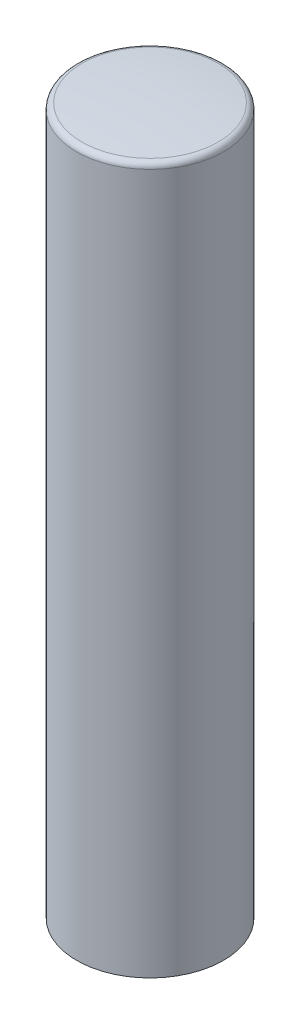
ISO-10303-21;
HEADER;
FILE_DESCRIPTION(('STEP AP214'),'2;1');
FILE_NAME('part.step','',(''),(''),'','','');
FILE_SCHEMA(('AUTOMOTIVE_DESIGN { 1 0 10303 214 1 1 1 1 }'));
ENDSEC;
DATA;
#1=APPLICATION_CONTEXT('core data for automotive mechanical design processes');
#2=APPLICATION_PROTOCOL_DEFINITION('international standard','automotive_design',2000,#1);
#3=PRODUCT_CONTEXT('',#1,'mechanical');
#4=PRODUCT('Part','Part','',(#3));
#5=PRODUCT_RELATED_PRODUCT_CATEGORY('part','',(#4));
#6=PRODUCT_DEFINITION_FORMATION('','',#4);
#7=PRODUCT_DEFINITION_CONTEXT('part definition',#1,'design');
#8=PRODUCT_DEFINITION('design','',#6,#7);
#9=PRODUCT_DEFINITION_SHAPE('','',#8);
#10=(LENGTH_UNIT() NAMED_UNIT(*) SI_UNIT(.MILLI.,.METRE.));
#11=(NAMED_UNIT(*) PLANE_ANGLE_UNIT() SI_UNIT($,.RADIAN.));
#12=(NAMED_UNIT(*) SI_UNIT($,.STERADIAN.) SOLID_ANGLE_UNIT());
#13=UNCERTAINTY_MEASURE_WITH_UNIT(LENGTH_MEASURE(1.E-05),#10,'distance_accuracy_value','');
#14=(GEOMETRIC_REPRESENTATION_CONTEXT(3) GLOBAL_UNCERTAINTY_ASSIGNED_CONTEXT((#13)) GLOBAL_UNIT_ASSIGNED_CONTEXT((#10,
#11,#12)) REPRESENTATION_CONTEXT('',''));
#15=CARTESIAN_POINT('',(0.,0.,0.));
#16=DIRECTION('',(0.,0.,1.));
#17=DIRECTION('',(1.,0.,0.));
#18=AXIS2_PLACEMENT_3D('',#15,#16,#17);
#19=CARTESIAN_POINT('',(0.,0.,0.));
#20=DIRECTION('',(0.,-1.,0.));
#21=DIRECTION('',(0.,0.,-1.));
#22=AXIS2_PLACEMENT_3D('',#19,#20,#21);
#23=SPHERICAL_SURFACE('',#22,24.1298570240273);
#24=CARTESIAN_POINT('',(0.,24.0181432542596,0.));
#25=DIRECTION('',(0.,-1.,0.));
#26=DIRECTION('',(0.,0.,-1.));
#27=AXIS2_PLACEMENT_3D('',#24,#25,#26);
#28=CIRCLE('',#27,2.31922284782304);
#29=CARTESIAN_POINT('',(0.,24.0181432542596,-2.31922284782304));
#30=VERTEX_POINT('',#29);
#31=EDGE_CURVE('E10',#30,#30,#28,.F.);
#32=ORIENTED_EDGE('',*,*,#31,.T.);
#33=EDGE_LOOP('',(#32));
#34=FACE_BOUND('',#33,.T.);
#35=ADVANCED_FACE('F33',(#34),#23,.T.);
#36=CARTESIAN_POINT('',(0.,0.,0.));
#37=DIRECTION('',(0.,-1.,0.));
#38=DIRECTION('',(0.,0.,-1.));
#39=AXIS2_PLACEMENT_3D('',#36,#37,#38);
#40=CYLINDRICAL_SURFACE('',#39,2.5);
#41=CARTESIAN_POINT('',(0.,23.8190691923591,0.));
#42=DIRECTION('',(0.,-1.,0.));
#43=DIRECTION('',(0.,0.,-1.));
#44=AXIS2_PLACEMENT_3D('',#41,#42,#43);
#45=CIRCLE('',#44,2.5);
#46=CARTESIAN_POINT('',(0.,23.8190691923591,-2.5));
#47=VERTEX_POINT('',#46);
#48=EDGE_CURVE('E40',#47,#47,#45,.T.);
#49=ORIENTED_EDGE('',*,*,#48,.T.);
#50=EDGE_LOOP('',(#49));
#51=FACE_BOUND('',#50,.T.);
#52=CARTESIAN_POINT('',(0.,0.,0.));
#53=DIRECTION('',(0.,-1.,0.));
#54=DIRECTION('',(0.,0.,-1.));
#55=AXIS2_PLACEMENT_3D('',#52,#53,#54);
#56=CIRCLE('',#55,2.5);
#57=CARTESIAN_POINT('',(0.,0.,-2.5));
#58=VERTEX_POINT('',#57);
#59=EDGE_CURVE('E44',#58,#58,#56,.T.);
#60=ORIENTED_EDGE('',*,*,#59,.F.);
#61=EDGE_LOOP('',(#60));
#62=FACE_BOUND('',#61,.T.);
#63=ADVANCED_FACE('F53',(#51,#62),#40,.T.);
#64=CARTESIAN_POINT('',(0.,0.,0.));
#65=DIRECTION('',(0.,1.,0.));
#66=DIRECTION('',(0.,0.,1.));
#67=AXIS2_PLACEMENT_3D('',#64,#65,#66);
#68=PLANE('',#67);
#69=ORIENTED_EDGE('',*,*,#59,.T.);
#70=EDGE_LOOP('',(#69));
#71=FACE_BOUND('',#70,.T.);
#72=ADVANCED_FACE('F51',(#71),#68,.F.);
#73=CARTESIAN_POINT('',(0.,23.8190691923591,0.));
#74=DIRECTION('',(0.,-1.,0.));
#75=DIRECTION('',(0.,0.,-1.));
#76=AXIS2_PLACEMENT_3D('',#73,#74,#75);
#77=TOROIDAL_SURFACE('',#76,2.3,0.2);
#78=ORIENTED_EDGE('',*,*,#31,.F.);
#79=EDGE_LOOP('',(#78));
#80=FACE_BOUND('',#79,.T.);
#81=ORIENTED_EDGE('',*,*,#48,.F.);
#82=EDGE_LOOP('',(#81));
#83=FACE_BOUND('',#82,.T.);
#84=ADVANCED_FACE('F35',(#80,#83),#77,.T.);
#85=CLOSED_SHELL('',(#35,#63,#72,#84));
#86=MANIFOLD_SOLID_BREP('B2',#85);
#87=ADVANCED_BREP_SHAPE_REPRESENTATION('',(#18,#86),#14);
#88=SHAPE_DEFINITION_REPRESENTATION(#9,#87);
ENDSEC;
END-ISO-10303-21;
